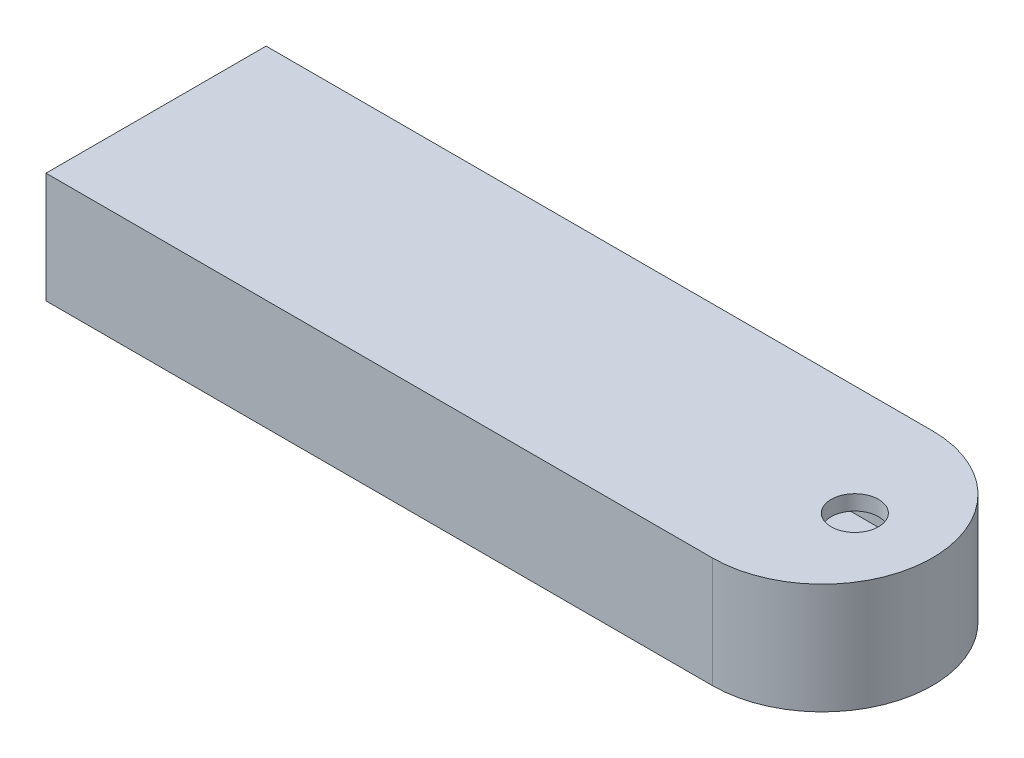
ISO-10303-21;
HEADER;
FILE_DESCRIPTION(('STEP AP214'),'2;1');
FILE_NAME('part.step','',(''),(''),'','','');
FILE_SCHEMA(('AUTOMOTIVE_DESIGN { 1 0 10303 214 1 1 1 1 }'));
ENDSEC;
DATA;
#1=APPLICATION_CONTEXT('core data for automotive mechanical design processes');
#2=APPLICATION_PROTOCOL_DEFINITION('international standard','automotive_design',2000,#1);
#3=PRODUCT_CONTEXT('',#1,'mechanical');
#4=PRODUCT('Part','Part','',(#3));
#5=PRODUCT_RELATED_PRODUCT_CATEGORY('part','',(#4));
#6=PRODUCT_DEFINITION_FORMATION('','',#4);
#7=PRODUCT_DEFINITION_CONTEXT('part definition',#1,'design');
#8=PRODUCT_DEFINITION('design','',#6,#7);
#9=PRODUCT_DEFINITION_SHAPE('','',#8);
#10=(LENGTH_UNIT() NAMED_UNIT(*) SI_UNIT(.MILLI.,.METRE.));
#11=(NAMED_UNIT(*) PLANE_ANGLE_UNIT() SI_UNIT($,.RADIAN.));
#12=(NAMED_UNIT(*) SI_UNIT($,.STERADIAN.) SOLID_ANGLE_UNIT());
#13=UNCERTAINTY_MEASURE_WITH_UNIT(LENGTH_MEASURE(1.E-05),#10,'distance_accuracy_value','');
#14=(GEOMETRIC_REPRESENTATION_CONTEXT(3) GLOBAL_UNCERTAINTY_ASSIGNED_CONTEXT((#13)) GLOBAL_UNIT_ASSIGNED_CONTEXT((#10,
#11,#12)) REPRESENTATION_CONTEXT('',''));
#15=CARTESIAN_POINT('',(0.,0.,0.));
#16=DIRECTION('',(0.,0.,1.));
#17=DIRECTION('',(1.,0.,0.));
#18=AXIS2_PLACEMENT_3D('',#15,#16,#17);
#19=CARTESIAN_POINT('',(33.4983346988671,14.7,-1.51404176251173));
#20=DIRECTION('',(0.,-1.,0.));
#21=DIRECTION('',(0.,0.,-1.));
#22=AXIS2_PLACEMENT_3D('',#19,#20,#21);
#23=CYLINDRICAL_SURFACE('',#22,3.155);
#24=CARTESIAN_POINT('',(33.4983346988671,12.7,-1.51404176251173));
#25=DIRECTION('',(0.,1.,0.));
#26=DIRECTION('',(0.,0.,1.));
#27=AXIS2_PLACEMENT_3D('',#24,#25,#26);
#28=CIRCLE('',#27,3.155);
#29=CARTESIAN_POINT('',(33.4983346988671,12.7,1.64095823748827));
#30=VERTEX_POINT('',#29);
#31=EDGE_CURVE('E166',#30,#30,#28,.T.);
#32=ORIENTED_EDGE('',*,*,#31,.F.);
#33=EDGE_LOOP('',(#32));
#34=FACE_BOUND('',#33,.T.);
#35=CARTESIAN_POINT('',(33.4983346988671,14.7,-1.51404176251173));
#36=DIRECTION('',(0.,1.,0.));
#37=DIRECTION('',(0.,0.,1.));
#38=AXIS2_PLACEMENT_3D('',#35,#36,#37);
#39=CIRCLE('',#38,3.155);
#40=CARTESIAN_POINT('',(33.4983346988671,14.7,1.64095823748827));
#41=VERTEX_POINT('',#40);
#42=EDGE_CURVE('E195',#41,#41,#39,.T.);
#43=ORIENTED_EDGE('',*,*,#42,.T.);
#44=EDGE_LOOP('',(#43));
#45=FACE_BOUND('',#44,.T.);
#46=ADVANCED_FACE('F60',(#34,#45),#23,.F.);
#47=CARTESIAN_POINT('',(-59.361665301133,14.7,-16.1390417625117));
#48=DIRECTION('',(1.,0.,0.));
#49=DIRECTION('',(0.,0.,-1.));
#50=AXIS2_PLACEMENT_3D('',#47,#48,#49);
#51=PLANE('',#50);
#52=DIRECTION('',(0.,0.,1.));
#53=VECTOR('',#52,1.);
#54=CARTESIAN_POINT('',(-59.361665301133,0.,-16.1390417625117));
#55=LINE('',#54,#53);
#56=CARTESIAN_POINT('',(-59.361665301133,0.,-16.1390417625117));
#57=VERTEX_POINT('',#56);
#58=CARTESIAN_POINT('',(-59.361665301133,0.,13.1109582374883));
#59=VERTEX_POINT('',#58);
#60=EDGE_CURVE('E177',#57,#59,#55,.T.);
#61=ORIENTED_EDGE('',*,*,#60,.T.);
#62=DIRECTION('',(0.,-1.,0.));
#63=VECTOR('',#62,1.);
#64=CARTESIAN_POINT('',(-59.361665301133,14.7,13.1109582374883));
#65=LINE('',#64,#63);
#66=CARTESIAN_POINT('',(-59.361665301133,14.7,13.1109582374883));
#67=VERTEX_POINT('',#66);
#68=EDGE_CURVE('E69',#67,#59,#65,.T.);
#69=ORIENTED_EDGE('',*,*,#68,.F.);
#70=DIRECTION('',(0.,0.,1.));
#71=VECTOR('',#70,1.);
#72=CARTESIAN_POINT('',(-59.361665301133,14.7,-16.1390417625117));
#73=LINE('',#72,#71);
#74=CARTESIAN_POINT('',(-59.361665301133,14.7,-16.1390417625117));
#75=VERTEX_POINT('',#74);
#76=EDGE_CURVE('E180',#75,#67,#73,.T.);
#77=ORIENTED_EDGE('',*,*,#76,.F.);
#78=DIRECTION('',(0.,-1.,0.));
#79=VECTOR('',#78,1.);
#80=CARTESIAN_POINT('',(-59.361665301133,14.7,-16.1390417625117));
#81=LINE('',#80,#79);
#82=EDGE_CURVE('E12',#75,#57,#81,.T.);
#83=ORIENTED_EDGE('',*,*,#82,.T.);
#84=EDGE_LOOP('',(#61,#69,#77,#83));
#85=FACE_BOUND('',#84,.T.);
#86=DIRECTION('',(0.,0.,1.));
#87=VECTOR('',#86,1.);
#88=CARTESIAN_POINT('',(-59.361665301133,2.,0.));
#89=LINE('',#88,#87);
#90=CARTESIAN_POINT('',(-59.361665301133,2.,-14.1390417625117));
#91=VERTEX_POINT('',#90);
#92=CARTESIAN_POINT('',(-59.361665301133,2.,11.1109582374883));
#93=VERTEX_POINT('',#92);
#94=EDGE_CURVE('E159',#91,#93,#89,.T.);
#95=ORIENTED_EDGE('',*,*,#94,.F.);
#96=DIRECTION('',(0.,-1.,0.));
#97=VECTOR('',#96,1.);
#98=CARTESIAN_POINT('',(-59.361665301133,14.7,-14.1390417625117));
#99=LINE('',#98,#97);
#100=CARTESIAN_POINT('',(-59.361665301133,12.7,-14.1390417625117));
#101=VERTEX_POINT('',#100);
#102=EDGE_CURVE('E169',#101,#91,#99,.T.);
#103=ORIENTED_EDGE('',*,*,#102,.F.);
#104=DIRECTION('',(0.,0.,1.));
#105=VECTOR('',#104,1.);
#106=CARTESIAN_POINT('',(-59.361665301133,12.7,0.));
#107=LINE('',#106,#105);
#108=CARTESIAN_POINT('',(-59.361665301133,12.7,11.1109582374883));
#109=VERTEX_POINT('',#108);
#110=EDGE_CURVE('E156',#101,#109,#107,.T.);
#111=ORIENTED_EDGE('',*,*,#110,.T.);
#112=DIRECTION('',(0.,-1.,0.));
#113=VECTOR('',#112,1.);
#114=CARTESIAN_POINT('',(-59.361665301133,14.7,11.1109582374883));
#115=LINE('',#114,#113);
#116=EDGE_CURVE('E143',#109,#93,#115,.T.);
#117=ORIENTED_EDGE('',*,*,#116,.T.);
#118=EDGE_LOOP('',(#95,#103,#111,#117));
#119=FACE_BOUND('',#118,.T.);
#120=ADVANCED_FACE('F211',(#85,#119),#51,.F.);
#121=CARTESIAN_POINT('',(-59.361665301133,14.7,13.1109582374883));
#122=DIRECTION('',(0.,0.,-1.));
#123=DIRECTION('',(-1.,0.,0.));
#124=AXIS2_PLACEMENT_3D('',#121,#122,#123);
#125=PLANE('',#124);
#126=DIRECTION('',(1.,0.,0.));
#127=VECTOR('',#126,1.);
#128=CARTESIAN_POINT('',(-59.361665301133,0.,13.1109582374883));
#129=LINE('',#128,#127);
#130=CARTESIAN_POINT('',(29.188334698867,0.,13.1109582374882));
#131=VERTEX_POINT('',#130);
#132=EDGE_CURVE('E185',#59,#131,#129,.T.);
#133=ORIENTED_EDGE('',*,*,#132,.T.);
#134=DIRECTION('',(0.,-1.,0.));
#135=VECTOR('',#134,1.);
#136=CARTESIAN_POINT('',(29.188334698867,14.7,13.1109582374882));
#137=LINE('',#136,#135);
#138=CARTESIAN_POINT('',(29.188334698867,14.7,13.1109582374882));
#139=VERTEX_POINT('',#138);
#140=EDGE_CURVE('E192',#139,#131,#137,.T.);
#141=ORIENTED_EDGE('',*,*,#140,.F.);
#142=DIRECTION('',(1.,0.,0.));
#143=VECTOR('',#142,1.);
#144=CARTESIAN_POINT('',(-59.361665301133,14.7,13.1109582374883));
#145=LINE('',#144,#143);
#146=EDGE_CURVE('E176',#67,#139,#145,.T.);
#147=ORIENTED_EDGE('',*,*,#146,.F.);
#148=ORIENTED_EDGE('',*,*,#68,.T.);
#149=EDGE_LOOP('',(#133,#141,#147,#148));
#150=FACE_BOUND('',#149,.T.);
#151=ADVANCED_FACE('F214',(#150),#125,.F.);
#152=CARTESIAN_POINT('',(-59.361665301133,14.7,-16.1390417625117));
#153=DIRECTION('',(0.,0.,-1.));
#154=DIRECTION('',(-1.,0.,0.));
#155=AXIS2_PLACEMENT_3D('',#152,#153,#154);
#156=PLANE('',#155);
#157=DIRECTION('',(1.,0.,0.));
#158=VECTOR('',#157,1.);
#159=CARTESIAN_POINT('',(-59.361665301133,0.,-16.1390417625117));
#160=LINE('',#159,#158);
#161=CARTESIAN_POINT('',(29.188334698867,0.,-16.1390417625117));
#162=VERTEX_POINT('',#161);
#163=EDGE_CURVE('E182',#57,#162,#160,.T.);
#164=ORIENTED_EDGE('',*,*,#163,.F.);
#165=ORIENTED_EDGE('',*,*,#82,.F.);
#166=DIRECTION('',(1.,0.,0.));
#167=VECTOR('',#166,1.);
#168=CARTESIAN_POINT('',(-59.361665301133,14.7,-16.1390417625117));
#169=LINE('',#168,#167);
#170=CARTESIAN_POINT('',(29.188334698867,14.7,-16.1390417625117));
#171=VERTEX_POINT('',#170);
#172=EDGE_CURVE('E174',#75,#171,#169,.T.);
#173=ORIENTED_EDGE('',*,*,#172,.T.);
#174=DIRECTION('',(0.,-1.,0.));
#175=VECTOR('',#174,1.);
#176=CARTESIAN_POINT('',(29.188334698867,14.7,-16.1390417625117));
#177=LINE('',#176,#175);
#178=EDGE_CURVE('E109',#171,#162,#177,.T.);
#179=ORIENTED_EDGE('',*,*,#178,.T.);
#180=EDGE_LOOP('',(#164,#165,#173,#179));
#181=FACE_BOUND('',#180,.T.);
#182=ADVANCED_FACE('F206',(#181),#156,.T.);
#183=CARTESIAN_POINT('',(0.,0.,0.));
#184=DIRECTION('',(0.,-1.,0.));
#185=DIRECTION('',(0.,0.,-1.));
#186=AXIS2_PLACEMENT_3D('',#183,#184,#185);
#187=PLANE('',#186);
#188=ORIENTED_EDGE('',*,*,#163,.T.);
#189=CARTESIAN_POINT('',(29.188334698867,0.,-1.51404176251173));
#190=DIRECTION('',(0.,1.,0.));
#191=DIRECTION('',(0.,0.,1.));
#192=AXIS2_PLACEMENT_3D('',#189,#190,#191);
#193=CIRCLE('',#192,14.625);
#194=EDGE_CURVE('E64',#131,#162,#193,.T.);
#195=ORIENTED_EDGE('',*,*,#194,.F.);
#196=ORIENTED_EDGE('',*,*,#132,.F.);
#197=ORIENTED_EDGE('',*,*,#60,.F.);
#198=EDGE_LOOP('',(#188,#195,#196,#197));
#199=FACE_BOUND('',#198,.T.);
#200=CARTESIAN_POINT('',(33.4983346988671,0.,-1.51404176251173));
#201=DIRECTION('',(0.,1.,0.));
#202=DIRECTION('',(0.,0.,1.));
#203=AXIS2_PLACEMENT_3D('',#200,#201,#202);
#204=CIRCLE('',#203,3.155);
#205=CARTESIAN_POINT('',(33.4983346988671,0.,1.64095823748827));
#206=VERTEX_POINT('',#205);
#207=EDGE_CURVE('E172',#206,#206,#204,.T.);
#208=ORIENTED_EDGE('',*,*,#207,.T.);
#209=EDGE_LOOP('',(#208));
#210=FACE_BOUND('',#209,.T.);
#211=ADVANCED_FACE('F204',(#199,#210),#187,.T.);
#212=CARTESIAN_POINT('',(0.,14.7,0.));
#213=DIRECTION('',(0.,-1.,0.));
#214=DIRECTION('',(0.,0.,-1.));
#215=AXIS2_PLACEMENT_3D('',#212,#213,#214);
#216=PLANE('',#215);
#217=ORIENTED_EDGE('',*,*,#146,.T.);
#218=CARTESIAN_POINT('',(29.188334698867,14.7,-1.51404176251173));
#219=DIRECTION('',(0.,1.,0.));
#220=DIRECTION('',(0.,0.,1.));
#221=AXIS2_PLACEMENT_3D('',#218,#219,#220);
#222=CIRCLE('',#221,14.625);
#223=EDGE_CURVE('E186',#139,#171,#222,.T.);
#224=ORIENTED_EDGE('',*,*,#223,.T.);
#225=ORIENTED_EDGE('',*,*,#172,.F.);
#226=ORIENTED_EDGE('',*,*,#76,.T.);
#227=EDGE_LOOP('',(#217,#224,#225,#226));
#228=FACE_BOUND('',#227,.T.);
#229=ORIENTED_EDGE('',*,*,#42,.F.);
#230=EDGE_LOOP('',(#229));
#231=FACE_BOUND('',#230,.T.);
#232=ADVANCED_FACE('F207',(#228,#231),#216,.F.);
#233=CARTESIAN_POINT('',(33.4983346988671,2.,-1.51404176251173));
#234=DIRECTION('',(0.,-1.,0.));
#235=DIRECTION('',(0.,0.,-1.));
#236=AXIS2_PLACEMENT_3D('',#233,#234,#235);
#237=CIRCLE('',#236,3.155);
#238=CARTESIAN_POINT('',(33.4983346988671,2.,-4.66904176251173));
#239=VERTEX_POINT('',#238);
#240=EDGE_CURVE('E336',#239,#239,#237,.T.);
#241=ORIENTED_EDGE('',*,*,#240,.F.);
#242=EDGE_LOOP('',(#241));
#243=FACE_BOUND('',#242,.T.);
#244=ORIENTED_EDGE('',*,*,#207,.F.);
#245=EDGE_LOOP('',(#244));
#246=FACE_BOUND('',#245,.T.);
#247=ADVANCED_FACE('F225',(#243,#246),#23,.F.);
#248=CARTESIAN_POINT('',(29.188334698867,14.7,-1.51404176251173));
#249=DIRECTION('',(0.,-1.,0.));
#250=DIRECTION('',(0.,0.,-1.));
#251=AXIS2_PLACEMENT_3D('',#248,#249,#250);
#252=CYLINDRICAL_SURFACE('',#251,14.625);
#253=ORIENTED_EDGE('',*,*,#140,.T.);
#254=ORIENTED_EDGE('',*,*,#194,.T.);
#255=ORIENTED_EDGE('',*,*,#178,.F.);
#256=ORIENTED_EDGE('',*,*,#223,.F.);
#257=EDGE_LOOP('',(#253,#254,#255,#256));
#258=FACE_BOUND('',#257,.T.);
#259=ADVANCED_FACE('F62',(#258),#252,.T.);
#260=CARTESIAN_POINT('',(-59.361665301133,14.7,11.1109582374883));
#261=DIRECTION('',(0.,0.,-1.));
#262=DIRECTION('',(-1.,0.,0.));
#263=AXIS2_PLACEMENT_3D('',#260,#261,#262);
#264=PLANE('',#263);
#265=DIRECTION('',(1.,0.,0.));
#266=VECTOR('',#265,1.);
#267=CARTESIAN_POINT('',(0.,2.,11.1109582374883));
#268=LINE('',#267,#266);
#269=CARTESIAN_POINT('',(29.188334698867,2.,11.1109582374882));
#270=VERTEX_POINT('',#269);
#271=EDGE_CURVE('E165',#93,#270,#268,.T.);
#272=ORIENTED_EDGE('',*,*,#271,.F.);
#273=ORIENTED_EDGE('',*,*,#116,.F.);
#274=DIRECTION('',(1.,0.,0.));
#275=VECTOR('',#274,1.);
#276=CARTESIAN_POINT('',(0.,12.7,11.1109582374883));
#277=LINE('',#276,#275);
#278=CARTESIAN_POINT('',(29.188334698867,12.7,11.1109582374882));
#279=VERTEX_POINT('',#278);
#280=EDGE_CURVE('E150',#109,#279,#277,.T.);
#281=ORIENTED_EDGE('',*,*,#280,.T.);
#282=DIRECTION('',(0.,-1.,0.));
#283=VECTOR('',#282,1.);
#284=CARTESIAN_POINT('',(29.188334698867,14.7,11.1109582374882));
#285=LINE('',#284,#283);
#286=EDGE_CURVE('E133',#279,#270,#285,.T.);
#287=ORIENTED_EDGE('',*,*,#286,.T.);
#288=EDGE_LOOP('',(#272,#273,#281,#287));
#289=FACE_BOUND('',#288,.T.);
#290=ADVANCED_FACE('F154',(#289),#264,.T.);
#291=CARTESIAN_POINT('',(-59.361665301133,14.7,-14.1390417625117));
#292=DIRECTION('',(0.,0.,-1.));
#293=DIRECTION('',(-1.,0.,0.));
#294=AXIS2_PLACEMENT_3D('',#291,#292,#293);
#295=PLANE('',#294);
#296=DIRECTION('',(1.,0.,0.));
#297=VECTOR('',#296,1.);
#298=CARTESIAN_POINT('',(0.,2.,-14.1390417625117));
#299=LINE('',#298,#297);
#300=CARTESIAN_POINT('',(29.188334698867,2.,-14.1390417625117));
#301=VERTEX_POINT('',#300);
#302=EDGE_CURVE('E152',#91,#301,#299,.T.);
#303=ORIENTED_EDGE('',*,*,#302,.T.);
#304=DIRECTION('',(0.,1.,0.));
#305=VECTOR('',#304,1.);
#306=CARTESIAN_POINT('',(29.188334698867,14.7,-14.1390417625117));
#307=LINE('',#306,#305);
#308=CARTESIAN_POINT('',(29.188334698867,12.7,-14.1390417625117));
#309=VERTEX_POINT('',#308);
#310=EDGE_CURVE('E144',#309,#301,#307,.F.);
#311=ORIENTED_EDGE('',*,*,#310,.F.);
#312=DIRECTION('',(1.,0.,0.));
#313=VECTOR('',#312,1.);
#314=CARTESIAN_POINT('',(0.,12.7,-14.1390417625117));
#315=LINE('',#314,#313);
#316=EDGE_CURVE('E77',#101,#309,#315,.T.);
#317=ORIENTED_EDGE('',*,*,#316,.F.);
#318=ORIENTED_EDGE('',*,*,#102,.T.);
#319=EDGE_LOOP('',(#303,#311,#317,#318));
#320=FACE_BOUND('',#319,.T.);
#321=ADVANCED_FACE('F242',(#320),#295,.F.);
#322=CARTESIAN_POINT('',(0.,2.,0.));
#323=DIRECTION('',(0.,-1.,0.));
#324=DIRECTION('',(0.,0.,-1.));
#325=AXIS2_PLACEMENT_3D('',#322,#323,#324);
#326=PLANE('',#325);
#327=ORIENTED_EDGE('',*,*,#302,.F.);
#328=ORIENTED_EDGE('',*,*,#94,.T.);
#329=ORIENTED_EDGE('',*,*,#271,.T.);
#330=CARTESIAN_POINT('',(29.188334698867,2.,-1.51404176251173));
#331=DIRECTION('',(0.,-1.,0.));
#332=DIRECTION('',(0.,0.,-1.));
#333=AXIS2_PLACEMENT_3D('',#330,#331,#332);
#334=CIRCLE('',#333,12.625);
#335=EDGE_CURVE('E138',#270,#301,#334,.F.);
#336=ORIENTED_EDGE('',*,*,#335,.T.);
#337=EDGE_LOOP('',(#327,#328,#329,#336));
#338=FACE_BOUND('',#337,.T.);
#339=ORIENTED_EDGE('',*,*,#240,.T.);
#340=EDGE_LOOP('',(#339));
#341=FACE_BOUND('',#340,.T.);
#342=ADVANCED_FACE('F247',(#338,#341),#326,.F.);
#343=CARTESIAN_POINT('',(0.,12.7,0.));
#344=DIRECTION('',(0.,-1.,0.));
#345=DIRECTION('',(0.,0.,-1.));
#346=AXIS2_PLACEMENT_3D('',#343,#344,#345);
#347=PLANE('',#346);
#348=ORIENTED_EDGE('',*,*,#280,.F.);
#349=ORIENTED_EDGE('',*,*,#110,.F.);
#350=ORIENTED_EDGE('',*,*,#316,.T.);
#351=CARTESIAN_POINT('',(29.188334698867,12.7,-1.51404176251173));
#352=DIRECTION('',(0.,-1.,0.));
#353=DIRECTION('',(0.,0.,-1.));
#354=AXIS2_PLACEMENT_3D('',#351,#352,#353);
#355=CIRCLE('',#354,12.625);
#356=EDGE_CURVE('E136',#279,#309,#355,.F.);
#357=ORIENTED_EDGE('',*,*,#356,.F.);
#358=EDGE_LOOP('',(#348,#349,#350,#357));
#359=FACE_BOUND('',#358,.T.);
#360=ORIENTED_EDGE('',*,*,#31,.T.);
#361=EDGE_LOOP('',(#360));
#362=FACE_BOUND('',#361,.T.);
#363=ADVANCED_FACE('F148',(#359,#362),#347,.T.);
#364=CARTESIAN_POINT('',(29.188334698867,14.7,-1.51404176251173));
#365=DIRECTION('',(0.,-1.,0.));
#366=DIRECTION('',(0.,0.,-1.));
#367=AXIS2_PLACEMENT_3D('',#364,#365,#366);
#368=CYLINDRICAL_SURFACE('',#367,12.625);
#369=ORIENTED_EDGE('',*,*,#286,.F.);
#370=ORIENTED_EDGE('',*,*,#356,.T.);
#371=ORIENTED_EDGE('',*,*,#310,.T.);
#372=ORIENTED_EDGE('',*,*,#335,.F.);
#373=EDGE_LOOP('',(#369,#370,#371,#372));
#374=FACE_BOUND('',#373,.T.);
#375=ADVANCED_FACE('F135',(#374),#368,.F.);
#376=CLOSED_SHELL('',(#46,#120,#151,#182,#211,#232,#247,#259,#290,#321,#342,#363,#375));
#377=MANIFOLD_SOLID_BREP('B2',#376);
#378=ADVANCED_BREP_SHAPE_REPRESENTATION('',(#18,#377),#14);
#379=SHAPE_DEFINITION_REPRESENTATION(#9,#378);
ENDSEC;
END-ISO-10303-21;
